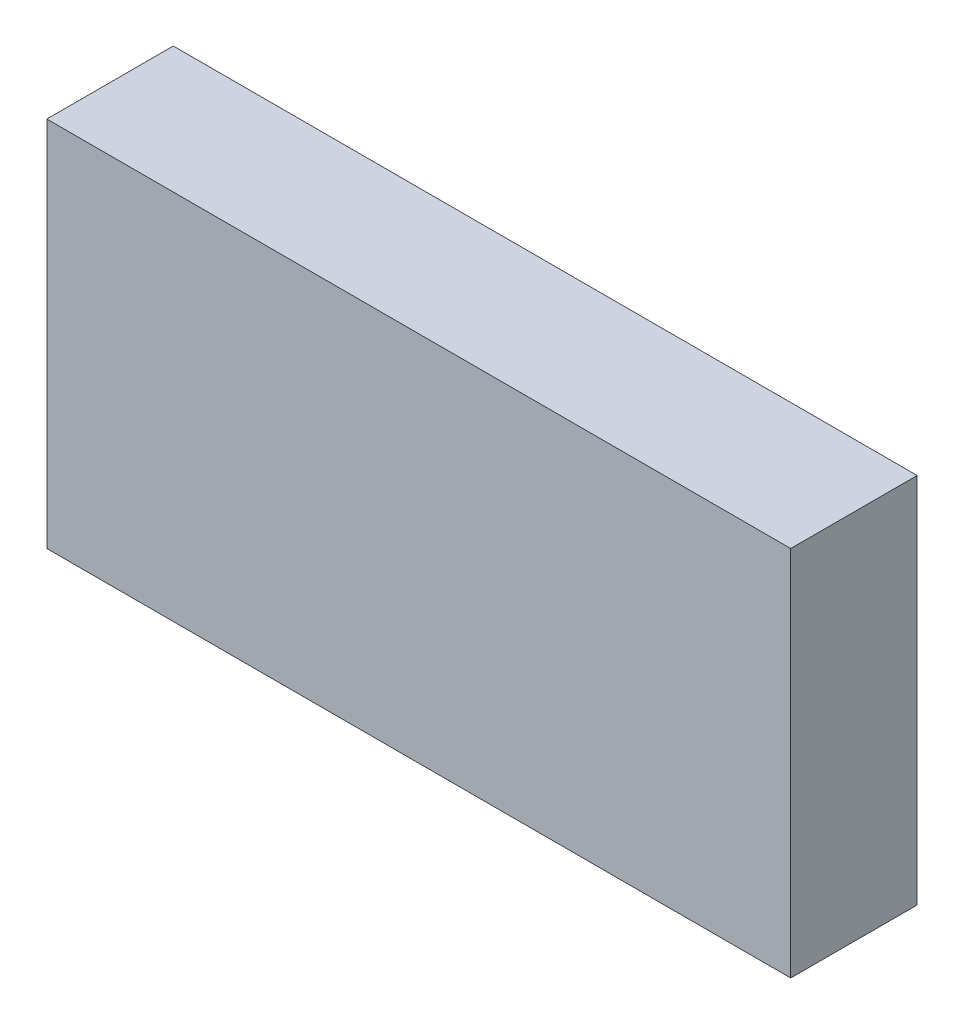
ISO-10303-21;
HEADER;
FILE_DESCRIPTION(('STEP AP214'),'2;1');
FILE_NAME('part.step','',(''),(''),'','','');
FILE_SCHEMA(('AUTOMOTIVE_DESIGN { 1 0 10303 214 1 1 1 1 }'));
ENDSEC;
DATA;
#1=APPLICATION_CONTEXT('core data for automotive mechanical design processes');
#2=APPLICATION_PROTOCOL_DEFINITION('international standard','automotive_design',2000,#1);
#3=PRODUCT_CONTEXT('',#1,'mechanical');
#4=PRODUCT('Part','Part','',(#3));
#5=PRODUCT_RELATED_PRODUCT_CATEGORY('part','',(#4));
#6=PRODUCT_DEFINITION_FORMATION('','',#4);
#7=PRODUCT_DEFINITION_CONTEXT('part definition',#1,'design');
#8=PRODUCT_DEFINITION('design','',#6,#7);
#9=PRODUCT_DEFINITION_SHAPE('','',#8);
#10=(LENGTH_UNIT() NAMED_UNIT(*) SI_UNIT(.MILLI.,.METRE.));
#11=(NAMED_UNIT(*) PLANE_ANGLE_UNIT() SI_UNIT($,.RADIAN.));
#12=(NAMED_UNIT(*) SI_UNIT($,.STERADIAN.) SOLID_ANGLE_UNIT());
#13=UNCERTAINTY_MEASURE_WITH_UNIT(LENGTH_MEASURE(1.E-05),#10,'distance_accuracy_value','');
#14=(GEOMETRIC_REPRESENTATION_CONTEXT(3) GLOBAL_UNCERTAINTY_ASSIGNED_CONTEXT((#13)) GLOBAL_UNIT_ASSIGNED_CONTEXT((#10,
#11,#12)) REPRESENTATION_CONTEXT('',''));
#15=CARTESIAN_POINT('',(0.,0.,0.));
#16=DIRECTION('',(0.,0.,1.));
#17=DIRECTION('',(1.,0.,0.));
#18=AXIS2_PLACEMENT_3D('',#15,#16,#17);
#19=CARTESIAN_POINT('',(-0.5,-0.25,0.32));
#20=DIRECTION('',(0.,0.,1.));
#21=DIRECTION('',(1.,0.,0.));
#22=AXIS2_PLACEMENT_3D('',#19,#20,#21);
#23=PLANE('',#22);
#24=DIRECTION('',(1.,0.,0.));
#25=VECTOR('',#24,1.);
#26=CARTESIAN_POINT('',(-0.5,-0.25,0.32));
#27=LINE('',#26,#25);
#28=CARTESIAN_POINT('',(-0.5,-0.25,0.32));
#29=VERTEX_POINT('',#28);
#30=CARTESIAN_POINT('',(0.5,-0.25,0.32));
#31=VERTEX_POINT('',#30);
#32=EDGE_CURVE('E20',#29,#31,#27,.T.);
#33=ORIENTED_EDGE('',*,*,#32,.T.);
#34=DIRECTION('',(0.,1.,0.));
#35=VECTOR('',#34,1.);
#36=CARTESIAN_POINT('',(0.5,-0.25,0.32));
#37=LINE('',#36,#35);
#38=CARTESIAN_POINT('',(0.5,0.25,0.32));
#39=VERTEX_POINT('',#38);
#40=EDGE_CURVE('E55',#31,#39,#37,.T.);
#41=ORIENTED_EDGE('',*,*,#40,.T.);
#42=DIRECTION('',(1.,0.,0.));
#43=VECTOR('',#42,1.);
#44=CARTESIAN_POINT('',(-0.5,0.25,0.32));
#45=LINE('',#44,#43);
#46=CARTESIAN_POINT('',(-0.5,0.25,0.32));
#47=VERTEX_POINT('',#46);
#48=EDGE_CURVE('E76',#39,#47,#45,.F.);
#49=ORIENTED_EDGE('',*,*,#48,.T.);
#50=DIRECTION('',(0.,1.,0.));
#51=VECTOR('',#50,1.);
#52=CARTESIAN_POINT('',(-0.5,-0.25,0.32));
#53=LINE('',#52,#51);
#54=EDGE_CURVE('E58',#47,#29,#53,.F.);
#55=ORIENTED_EDGE('',*,*,#54,.T.);
#56=EDGE_LOOP('',(#33,#41,#49,#55));
#57=FACE_BOUND('',#56,.T.);
#58=ADVANCED_FACE('F17',(#57),#23,.T.);
#59=CARTESIAN_POINT('',(-0.5,-0.25,0.15));
#60=DIRECTION('',(0.,1.,0.));
#61=DIRECTION('',(0.,0.,1.));
#62=AXIS2_PLACEMENT_3D('',#59,#60,#61);
#63=PLANE('',#62);
#64=ORIENTED_EDGE('',*,*,#32,.F.);
#65=DIRECTION('',(0.,0.,-1.));
#66=VECTOR('',#65,1.);
#67=CARTESIAN_POINT('',(-0.5,-0.25,0.15));
#68=LINE('',#67,#66);
#69=CARTESIAN_POINT('',(-0.5,-0.25,0.15));
#70=VERTEX_POINT('',#69);
#71=EDGE_CURVE('E80',#29,#70,#68,.T.);
#72=ORIENTED_EDGE('',*,*,#71,.T.);
#73=DIRECTION('',(1.,0.,0.));
#74=VECTOR('',#73,1.);
#75=CARTESIAN_POINT('',(-0.5,-0.25,0.15));
#76=LINE('',#75,#74);
#77=CARTESIAN_POINT('',(0.5,-0.25,0.15));
#78=VERTEX_POINT('',#77);
#79=EDGE_CURVE('E73',#70,#78,#76,.T.);
#80=ORIENTED_EDGE('',*,*,#79,.T.);
#81=DIRECTION('',(0.,0.,1.));
#82=VECTOR('',#81,1.);
#83=CARTESIAN_POINT('',(0.5,-0.25,0.15));
#84=LINE('',#83,#82);
#85=EDGE_CURVE('E63',#78,#31,#84,.T.);
#86=ORIENTED_EDGE('',*,*,#85,.T.);
#87=EDGE_LOOP('',(#64,#72,#80,#86));
#88=FACE_BOUND('',#87,.T.);
#89=ADVANCED_FACE('F72',(#88),#63,.F.);
#90=CARTESIAN_POINT('',(0.5,-0.25,0.15));
#91=DIRECTION('',(-1.,0.,0.));
#92=DIRECTION('',(0.,0.,1.));
#93=AXIS2_PLACEMENT_3D('',#90,#91,#92);
#94=PLANE('',#93);
#95=ORIENTED_EDGE('',*,*,#40,.F.);
#96=ORIENTED_EDGE('',*,*,#85,.F.);
#97=DIRECTION('',(0.,1.,0.));
#98=VECTOR('',#97,1.);
#99=CARTESIAN_POINT('',(0.5,-0.25,0.15));
#100=LINE('',#99,#98);
#101=CARTESIAN_POINT('',(0.5,0.25,0.15));
#102=VERTEX_POINT('',#101);
#103=EDGE_CURVE('E83',#78,#102,#100,.T.);
#104=ORIENTED_EDGE('',*,*,#103,.T.);
#105=DIRECTION('',(0.,0.,-1.));
#106=VECTOR('',#105,1.);
#107=CARTESIAN_POINT('',(0.5,0.25,0.32));
#108=LINE('',#107,#106);
#109=EDGE_CURVE('E69',#102,#39,#108,.F.);
#110=ORIENTED_EDGE('',*,*,#109,.T.);
#111=EDGE_LOOP('',(#95,#96,#104,#110));
#112=FACE_BOUND('',#111,.T.);
#113=ADVANCED_FACE('F66',(#112),#94,.F.);
#114=CARTESIAN_POINT('',(-0.5,0.25,0.32));
#115=DIRECTION('',(0.,-1.,0.));
#116=DIRECTION('',(0.,0.,-1.));
#117=AXIS2_PLACEMENT_3D('',#114,#115,#116);
#118=PLANE('',#117);
#119=ORIENTED_EDGE('',*,*,#48,.F.);
#120=ORIENTED_EDGE('',*,*,#109,.F.);
#121=DIRECTION('',(1.,0.,0.));
#122=VECTOR('',#121,1.);
#123=CARTESIAN_POINT('',(-0.5,0.25,0.15));
#124=LINE('',#123,#122);
#125=CARTESIAN_POINT('',(-0.5,0.25,0.15));
#126=VERTEX_POINT('',#125);
#127=EDGE_CURVE('E26',#102,#126,#124,.F.);
#128=ORIENTED_EDGE('',*,*,#127,.T.);
#129=DIRECTION('',(0.,0.,-1.));
#130=VECTOR('',#129,1.);
#131=CARTESIAN_POINT('',(-0.5,0.25,0.15));
#132=LINE('',#131,#130);
#133=EDGE_CURVE('E34',#126,#47,#132,.F.);
#134=ORIENTED_EDGE('',*,*,#133,.T.);
#135=EDGE_LOOP('',(#119,#120,#128,#134));
#136=FACE_BOUND('',#135,.T.);
#137=ADVANCED_FACE('F88',(#136),#118,.F.);
#138=CARTESIAN_POINT('',(-0.5,-0.25,0.15));
#139=DIRECTION('',(1.,0.,0.));
#140=DIRECTION('',(0.,0.,-1.));
#141=AXIS2_PLACEMENT_3D('',#138,#139,#140);
#142=PLANE('',#141);
#143=ORIENTED_EDGE('',*,*,#54,.F.);
#144=ORIENTED_EDGE('',*,*,#133,.F.);
#145=DIRECTION('',(0.,1.,0.));
#146=VECTOR('',#145,1.);
#147=CARTESIAN_POINT('',(-0.5,-0.25,0.15));
#148=LINE('',#147,#146);
#149=EDGE_CURVE('E11',#126,#70,#148,.F.);
#150=ORIENTED_EDGE('',*,*,#149,.T.);
#151=ORIENTED_EDGE('',*,*,#71,.F.);
#152=EDGE_LOOP('',(#143,#144,#150,#151));
#153=FACE_BOUND('',#152,.T.);
#154=ADVANCED_FACE('F91',(#153),#142,.F.);
#155=CARTESIAN_POINT('',(-0.5,-0.25,0.15));
#156=DIRECTION('',(0.,0.,1.));
#157=DIRECTION('',(1.,0.,0.));
#158=AXIS2_PLACEMENT_3D('',#155,#156,#157);
#159=PLANE('',#158);
#160=ORIENTED_EDGE('',*,*,#127,.F.);
#161=ORIENTED_EDGE('',*,*,#103,.F.);
#162=ORIENTED_EDGE('',*,*,#79,.F.);
#163=ORIENTED_EDGE('',*,*,#149,.F.);
#164=EDGE_LOOP('',(#160,#161,#162,#163));
#165=FACE_BOUND('',#164,.T.);
#166=ADVANCED_FACE('F90',(#165),#159,.F.);
#167=CLOSED_SHELL('',(#58,#89,#113,#137,#154,#166));
#168=MANIFOLD_SOLID_BREP('B1',#167);
#169=ADVANCED_BREP_SHAPE_REPRESENTATION('',(#18,#168),#14);
#170=SHAPE_DEFINITION_REPRESENTATION(#9,#169);
ENDSEC;
END-ISO-10303-21;
